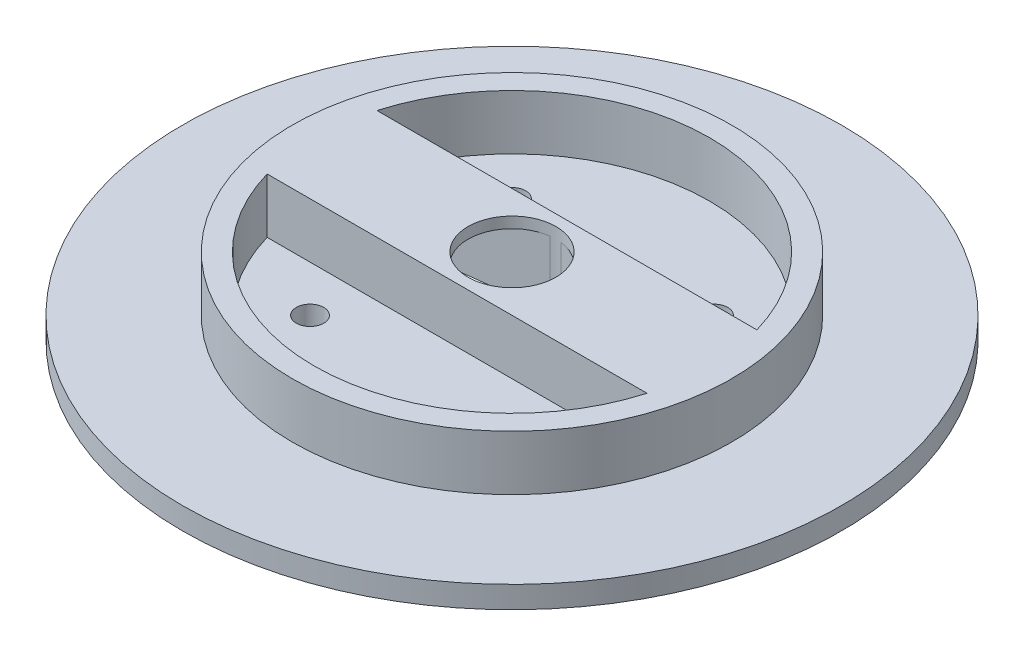
ISO-10303-21;
HEADER;
FILE_DESCRIPTION(('STEP AP214'),'2;1');
FILE_NAME('part.step','',(''),(''),'','','');
FILE_SCHEMA(('AUTOMOTIVE_DESIGN { 1 0 10303 214 1 1 1 1 }'));
ENDSEC;
DATA;
#1=APPLICATION_CONTEXT('core data for automotive mechanical design processes');
#2=APPLICATION_PROTOCOL_DEFINITION('international standard','automotive_design',2000,#1);
#3=PRODUCT_CONTEXT('',#1,'mechanical');
#4=PRODUCT('Part','Part','',(#3));
#5=PRODUCT_RELATED_PRODUCT_CATEGORY('part','',(#4));
#6=PRODUCT_DEFINITION_FORMATION('','',#4);
#7=PRODUCT_DEFINITION_CONTEXT('part definition',#1,'design');
#8=PRODUCT_DEFINITION('design','',#6,#7);
#9=PRODUCT_DEFINITION_SHAPE('','',#8);
#10=(LENGTH_UNIT() NAMED_UNIT(*) SI_UNIT(.MILLI.,.METRE.));
#11=(NAMED_UNIT(*) PLANE_ANGLE_UNIT() SI_UNIT($,.RADIAN.));
#12=(NAMED_UNIT(*) SI_UNIT($,.STERADIAN.) SOLID_ANGLE_UNIT());
#13=UNCERTAINTY_MEASURE_WITH_UNIT(LENGTH_MEASURE(1.E-05),#10,'distance_accuracy_value','');
#14=(GEOMETRIC_REPRESENTATION_CONTEXT(3) GLOBAL_UNCERTAINTY_ASSIGNED_CONTEXT((#13)) GLOBAL_UNIT_ASSIGNED_CONTEXT((#10,
#11,#12)) REPRESENTATION_CONTEXT('',''));
#15=CARTESIAN_POINT('',(0.,0.,0.));
#16=DIRECTION('',(0.,0.,1.));
#17=DIRECTION('',(1.,0.,0.));
#18=AXIS2_PLACEMENT_3D('',#15,#16,#17);
#19=CARTESIAN_POINT('',(0.,6.,0.));
#20=DIRECTION('',(0.,-1.,0.));
#21=DIRECTION('',(0.,0.,-1.));
#22=AXIS2_PLACEMENT_3D('',#19,#20,#21);
#23=PLANE('',#22);
#24=CARTESIAN_POINT('',(0.,6.,0.));
#25=DIRECTION('',(0.,-1.,0.));
#26=DIRECTION('',(0.,0.,-1.));
#27=AXIS2_PLACEMENT_3D('',#24,#25,#26);
#28=CIRCLE('',#27,4.);
#29=CARTESIAN_POINT('',(0.5,6.,-3.96862696659689));
#30=VERTEX_POINT('',#29);
#31=CARTESIAN_POINT('',(0.499999999999999,6.,3.96862696659689));
#32=VERTEX_POINT('',#31);
#33=EDGE_CURVE('E127',#30,#32,#28,.T.);
#34=ORIENTED_EDGE('',*,*,#33,.F.);
#35=DIRECTION('',(0.992156741649221,0.,0.125));
#36=VECTOR('',#35,1.);
#37=CARTESIAN_POINT('',(0.5,6.,-3.96862696659688));
#38=LINE('',#37,#36);
#39=CARTESIAN_POINT('',(16.25,6.,-1.98431348329844));
#40=VERTEX_POINT('',#39);
#41=EDGE_CURVE('E130',#30,#40,#38,.T.);
#42=ORIENTED_EDGE('',*,*,#41,.T.);
#43=CARTESIAN_POINT('',(16.,6.,0.));
#44=DIRECTION('',(0.,-1.,0.));
#45=DIRECTION('',(0.,0.,-1.));
#46=AXIS2_PLACEMENT_3D('',#43,#44,#45);
#47=CIRCLE('',#46,2.);
#48=CARTESIAN_POINT('',(16.25,6.,1.98431348329845));
#49=VERTEX_POINT('',#48);
#50=EDGE_CURVE('E147',#40,#49,#47,.T.);
#51=ORIENTED_EDGE('',*,*,#50,.T.);
#52=DIRECTION('',(-0.992156741649221,0.,0.125));
#53=VECTOR('',#52,1.);
#54=CARTESIAN_POINT('',(0.499999999999999,6.,3.96862696659689));
#55=LINE('',#54,#53);
#56=EDGE_CURVE('E132',#49,#32,#55,.T.);
#57=ORIENTED_EDGE('',*,*,#56,.T.);
#58=EDGE_LOOP('',(#34,#42,#51,#57));
#59=FACE_BOUND('',#58,.T.);
#60=ADVANCED_FACE('F35',(#59),#23,.T.);
#61=CARTESIAN_POINT('',(0.,2.,0.));
#62=DIRECTION('',(0.,1.,0.));
#63=DIRECTION('',(0.,0.,1.));
#64=AXIS2_PLACEMENT_3D('',#61,#62,#63);
#65=PLANE('',#64);
#66=CARTESIAN_POINT('',(9.1923881554251,2.,-9.19238815542513));
#67=DIRECTION('',(0.,1.,0.));
#68=DIRECTION('',(0.,0.,1.));
#69=AXIS2_PLACEMENT_3D('',#66,#67,#68);
#70=CIRCLE('',#69,1.25);
#71=CARTESIAN_POINT('',(9.1923881554251,2.,-7.94238815542513));
#72=VERTEX_POINT('',#71);
#73=EDGE_CURVE('E247',#72,#72,#70,.T.);
#74=ORIENTED_EDGE('',*,*,#73,.F.);
#75=EDGE_LOOP('',(#74));
#76=FACE_BOUND('',#75,.T.);
#77=CARTESIAN_POINT('',(-9.19238815542514,2.,-9.19238815542454));
#78=DIRECTION('',(0.,1.,0.));
#79=DIRECTION('',(0.,0.,1.));
#80=AXIS2_PLACEMENT_3D('',#77,#78,#79);
#81=CIRCLE('',#80,1.25);
#82=CARTESIAN_POINT('',(-9.19238815542514,2.,-7.94238815542454));
#83=VERTEX_POINT('',#82);
#84=EDGE_CURVE('E229',#83,#83,#81,.T.);
#85=ORIENTED_EDGE('',*,*,#84,.F.);
#86=EDGE_LOOP('',(#85));
#87=FACE_BOUND('',#86,.T.);
#88=DIRECTION('',(1.,0.,0.));
#89=VECTOR('',#88,1.);
#90=CARTESIAN_POINT('',(-17.2916164657906,2.,-5.));
#91=LINE('',#90,#89);
#92=CARTESIAN_POINT('',(-17.2916164657906,2.,-5.));
#93=VERTEX_POINT('',#92);
#94=CARTESIAN_POINT('',(17.2916164657906,2.,-5.));
#95=VERTEX_POINT('',#94);
#96=EDGE_CURVE('E215',#93,#95,#91,.T.);
#97=ORIENTED_EDGE('',*,*,#96,.T.);
#98=CARTESIAN_POINT('',(0.,2.,0.));
#99=DIRECTION('',(0.,1.,0.));
#100=DIRECTION('',(0.,0.,1.));
#101=AXIS2_PLACEMENT_3D('',#98,#99,#100);
#102=CIRCLE('',#101,18.);
#103=EDGE_CURVE('E210',#95,#93,#102,.T.);
#104=ORIENTED_EDGE('',*,*,#103,.T.);
#105=EDGE_LOOP('',(#97,#104));
#106=FACE_BOUND('',#105,.T.);
#107=ADVANCED_FACE('F289',(#76,#87,#106),#65,.T.);
#108=CARTESIAN_POINT('',(9.19238815542569,2.,9.1923881554251));
#109=DIRECTION('',(0.,1.,0.));
#110=DIRECTION('',(0.,0.,1.));
#111=AXIS2_PLACEMENT_3D('',#108,#109,#110);
#112=CIRCLE('',#111,1.25);
#113=CARTESIAN_POINT('',(9.19238815542569,2.,10.4423881554251));
#114=VERTEX_POINT('',#113);
#115=EDGE_CURVE('E241',#114,#114,#112,.T.);
#116=ORIENTED_EDGE('',*,*,#115,.F.);
#117=EDGE_LOOP('',(#116));
#118=FACE_BOUND('',#117,.T.);
#119=CARTESIAN_POINT('',(-9.19238815542455,2.,9.19238815542569));
#120=DIRECTION('',(0.,1.,0.));
#121=DIRECTION('',(0.,0.,1.));
#122=AXIS2_PLACEMENT_3D('',#119,#120,#121);
#123=CIRCLE('',#122,1.25);
#124=CARTESIAN_POINT('',(-9.19238815542455,2.,10.4423881554257));
#125=VERTEX_POINT('',#124);
#126=EDGE_CURVE('E235',#125,#125,#123,.T.);
#127=ORIENTED_EDGE('',*,*,#126,.F.);
#128=EDGE_LOOP('',(#127));
#129=FACE_BOUND('',#128,.T.);
#130=DIRECTION('',(-1.,0.,0.));
#131=VECTOR('',#130,1.);
#132=CARTESIAN_POINT('',(-17.2916164657906,2.,5.));
#133=LINE('',#132,#131);
#134=CARTESIAN_POINT('',(17.2916164657906,2.,5.));
#135=VERTEX_POINT('',#134);
#136=CARTESIAN_POINT('',(-17.2916164657906,2.,5.));
#137=VERTEX_POINT('',#136);
#138=EDGE_CURVE('E199',#135,#137,#133,.T.);
#139=ORIENTED_EDGE('',*,*,#138,.T.);
#140=CARTESIAN_POINT('',(0.,2.,0.));
#141=DIRECTION('',(0.,1.,0.));
#142=DIRECTION('',(0.,0.,1.));
#143=AXIS2_PLACEMENT_3D('',#140,#141,#142);
#144=CIRCLE('',#143,18.);
#145=EDGE_CURVE('E183',#137,#135,#144,.T.);
#146=ORIENTED_EDGE('',*,*,#145,.T.);
#147=EDGE_LOOP('',(#139,#146));
#148=FACE_BOUND('',#147,.T.);
#149=ADVANCED_FACE('F295',(#118,#129,#148),#65,.T.);
#150=CARTESIAN_POINT('',(0.,2.,0.));
#151=DIRECTION('',(0.,1.,0.));
#152=DIRECTION('',(0.,0.,1.));
#153=AXIS2_PLACEMENT_3D('',#150,#151,#152);
#154=CIRCLE('',#153,20.);
#155=CARTESIAN_POINT('',(0.,2.,20.));
#156=VERTEX_POINT('',#155);
#157=EDGE_CURVE('E11',#156,#156,#154,.T.);
#158=ORIENTED_EDGE('',*,*,#157,.F.);
#159=EDGE_LOOP('',(#158));
#160=FACE_BOUND('',#159,.T.);
#161=CARTESIAN_POINT('',(0.,2.,0.));
#162=DIRECTION('',(0.,1.,0.));
#163=DIRECTION('',(0.,0.,1.));
#164=AXIS2_PLACEMENT_3D('',#161,#162,#163);
#165=CIRCLE('',#164,30.);
#166=CARTESIAN_POINT('',(0.,2.,30.));
#167=VERTEX_POINT('',#166);
#168=EDGE_CURVE('E44',#167,#167,#165,.T.);
#169=ORIENTED_EDGE('',*,*,#168,.T.);
#170=EDGE_LOOP('',(#169));
#171=FACE_BOUND('',#170,.T.);
#172=ADVANCED_FACE('F261',(#160,#171),#65,.T.);
#173=CARTESIAN_POINT('',(0.,0.,0.));
#174=DIRECTION('',(0.,1.,0.));
#175=DIRECTION('',(0.,0.,1.));
#176=AXIS2_PLACEMENT_3D('',#173,#174,#175);
#177=PLANE('',#176);
#178=DIRECTION('',(0.992156741649221,0.,0.125));
#179=VECTOR('',#178,1.);
#180=CARTESIAN_POINT('',(0.5,0.,-3.96862696659688));
#181=LINE('',#180,#179);
#182=CARTESIAN_POINT('',(0.5,0.,-3.96862696659688));
#183=VERTEX_POINT('',#182);
#184=CARTESIAN_POINT('',(16.25,0.,-1.98431348329844));
#185=VERTEX_POINT('',#184);
#186=EDGE_CURVE('E165',#183,#185,#181,.T.);
#187=ORIENTED_EDGE('',*,*,#186,.F.);
#188=CARTESIAN_POINT('',(0.,0.,0.));
#189=DIRECTION('',(0.,-1.,0.));
#190=DIRECTION('',(0.,0.,-1.));
#191=AXIS2_PLACEMENT_3D('',#188,#189,#190);
#192=CIRCLE('',#191,4.);
#193=CARTESIAN_POINT('',(-0.5,0.,-3.96862696659688));
#194=VERTEX_POINT('',#193);
#195=EDGE_CURVE('E52',#194,#183,#192,.T.);
#196=ORIENTED_EDGE('',*,*,#195,.F.);
#197=DIRECTION('',(0.992156741649221,0.,-0.125));
#198=VECTOR('',#197,1.);
#199=CARTESIAN_POINT('',(-0.5,0.,-3.96862696659688));
#200=LINE('',#199,#198);
#201=CARTESIAN_POINT('',(-16.25,0.,-1.98431348329844));
#202=VERTEX_POINT('',#201);
#203=EDGE_CURVE('E148',#202,#194,#200,.T.);
#204=ORIENTED_EDGE('',*,*,#203,.F.);
#205=CARTESIAN_POINT('',(-16.,0.,0.));
#206=DIRECTION('',(0.,-1.,0.));
#207=DIRECTION('',(0.,0.,1.));
#208=AXIS2_PLACEMENT_3D('',#205,#206,#207);
#209=CIRCLE('',#208,2.);
#210=CARTESIAN_POINT('',(-16.25,0.,1.98431348329844));
#211=VERTEX_POINT('',#210);
#212=EDGE_CURVE('E152',#211,#202,#209,.T.);
#213=ORIENTED_EDGE('',*,*,#212,.F.);
#214=DIRECTION('',(-0.992156741649221,0.,-0.125));
#215=VECTOR('',#214,1.);
#216=CARTESIAN_POINT('',(-0.500000000000001,0.,3.96862696659689));
#217=LINE('',#216,#215);
#218=CARTESIAN_POINT('',(-0.500000000000001,0.,3.96862696659689));
#219=VERTEX_POINT('',#218);
#220=EDGE_CURVE('E176',#219,#211,#217,.T.);
#221=ORIENTED_EDGE('',*,*,#220,.F.);
#222=CARTESIAN_POINT('',(0.,0.,0.));
#223=DIRECTION('',(0.,-1.,0.));
#224=DIRECTION('',(0.,0.,-1.));
#225=AXIS2_PLACEMENT_3D('',#222,#223,#224);
#226=CIRCLE('',#225,4.);
#227=CARTESIAN_POINT('',(0.499999999999999,0.,3.96862696659689));
#228=VERTEX_POINT('',#227);
#229=EDGE_CURVE('E173',#228,#219,#226,.T.);
#230=ORIENTED_EDGE('',*,*,#229,.F.);
#231=DIRECTION('',(-0.992156741649221,0.,0.125));
#232=VECTOR('',#231,1.);
#233=CARTESIAN_POINT('',(0.499999999999999,0.,3.96862696659689));
#234=LINE('',#233,#232);
#235=CARTESIAN_POINT('',(16.25,0.,1.98431348329845));
#236=VERTEX_POINT('',#235);
#237=EDGE_CURVE('E170',#236,#228,#234,.T.);
#238=ORIENTED_EDGE('',*,*,#237,.F.);
#239=CARTESIAN_POINT('',(16.,0.,0.));
#240=DIRECTION('',(0.,-1.,0.));
#241=DIRECTION('',(0.,0.,-1.));
#242=AXIS2_PLACEMENT_3D('',#239,#240,#241);
#243=CIRCLE('',#242,2.);
#244=EDGE_CURVE('E167',#185,#236,#243,.T.);
#245=ORIENTED_EDGE('',*,*,#244,.F.);
#246=EDGE_LOOP('',(#187,#196,#204,#213,#221,#230,#238,#245));
#247=FACE_BOUND('',#246,.T.);
#248=CARTESIAN_POINT('',(0.,0.,0.));
#249=DIRECTION('',(0.,1.,0.));
#250=DIRECTION('',(0.,0.,1.));
#251=AXIS2_PLACEMENT_3D('',#248,#249,#250);
#252=CIRCLE('',#251,30.);
#253=CARTESIAN_POINT('',(0.,0.,30.));
#254=VERTEX_POINT('',#253);
#255=EDGE_CURVE('E250',#254,#254,#252,.T.);
#256=ORIENTED_EDGE('',*,*,#255,.F.);
#257=EDGE_LOOP('',(#256));
#258=FACE_BOUND('',#257,.T.);
#259=CARTESIAN_POINT('',(9.1923881554251,0.,-9.19238815542513));
#260=DIRECTION('',(0.,1.,0.));
#261=DIRECTION('',(0.,0.,1.));
#262=AXIS2_PLACEMENT_3D('',#259,#260,#261);
#263=CIRCLE('',#262,1.25);
#264=CARTESIAN_POINT('',(9.1923881554251,0.,-7.94238815542513));
#265=VERTEX_POINT('',#264);
#266=EDGE_CURVE('E244',#265,#265,#263,.T.);
#267=ORIENTED_EDGE('',*,*,#266,.T.);
#268=EDGE_LOOP('',(#267));
#269=FACE_BOUND('',#268,.T.);
#270=CARTESIAN_POINT('',(9.19238815542569,0.,9.1923881554251));
#271=DIRECTION('',(0.,1.,0.));
#272=DIRECTION('',(0.,0.,1.));
#273=AXIS2_PLACEMENT_3D('',#270,#271,#272);
#274=CIRCLE('',#273,1.25);
#275=CARTESIAN_POINT('',(9.19238815542569,0.,10.4423881554251));
#276=VERTEX_POINT('',#275);
#277=EDGE_CURVE('E238',#276,#276,#274,.T.);
#278=ORIENTED_EDGE('',*,*,#277,.T.);
#279=EDGE_LOOP('',(#278));
#280=FACE_BOUND('',#279,.T.);
#281=CARTESIAN_POINT('',(-9.19238815542455,0.,9.19238815542569));
#282=DIRECTION('',(0.,1.,0.));
#283=DIRECTION('',(0.,0.,1.));
#284=AXIS2_PLACEMENT_3D('',#281,#282,#283);
#285=CIRCLE('',#284,1.25);
#286=CARTESIAN_POINT('',(-9.19238815542455,0.,10.4423881554257));
#287=VERTEX_POINT('',#286);
#288=EDGE_CURVE('E232',#287,#287,#285,.T.);
#289=ORIENTED_EDGE('',*,*,#288,.T.);
#290=EDGE_LOOP('',(#289));
#291=FACE_BOUND('',#290,.T.);
#292=CARTESIAN_POINT('',(-9.19238815542514,0.,-9.19238815542454));
#293=DIRECTION('',(0.,1.,0.));
#294=DIRECTION('',(0.,0.,1.));
#295=AXIS2_PLACEMENT_3D('',#292,#293,#294);
#296=CIRCLE('',#295,1.25);
#297=CARTESIAN_POINT('',(-9.19238815542514,0.,-7.94238815542454));
#298=VERTEX_POINT('',#297);
#299=EDGE_CURVE('E227',#298,#298,#296,.T.);
#300=ORIENTED_EDGE('',*,*,#299,.T.);
#301=EDGE_LOOP('',(#300));
#302=FACE_BOUND('',#301,.T.);
#303=ADVANCED_FACE('F258',(#247,#258,#269,#280,#291,#302),#177,.F.);
#304=CARTESIAN_POINT('',(0.,2.,0.));
#305=DIRECTION('',(0.,-1.,0.));
#306=DIRECTION('',(0.,0.,-1.));
#307=AXIS2_PLACEMENT_3D('',#304,#305,#306);
#308=CYLINDRICAL_SURFACE('',#307,30.);
#309=ORIENTED_EDGE('',*,*,#168,.F.);
#310=EDGE_LOOP('',(#309));
#311=FACE_BOUND('',#310,.T.);
#312=ORIENTED_EDGE('',*,*,#255,.T.);
#313=EDGE_LOOP('',(#312));
#314=FACE_BOUND('',#313,.T.);
#315=ADVANCED_FACE('F37',(#311,#314),#308,.T.);
#316=CARTESIAN_POINT('',(9.1923881554251,2.,-9.19238815542513));
#317=DIRECTION('',(0.,-1.,0.));
#318=DIRECTION('',(0.,0.,-1.));
#319=AXIS2_PLACEMENT_3D('',#316,#317,#318);
#320=CYLINDRICAL_SURFACE('',#319,1.25);
#321=ORIENTED_EDGE('',*,*,#73,.T.);
#322=EDGE_LOOP('',(#321));
#323=FACE_BOUND('',#322,.T.);
#324=ORIENTED_EDGE('',*,*,#266,.F.);
#325=EDGE_LOOP('',(#324));
#326=FACE_BOUND('',#325,.T.);
#327=ADVANCED_FACE('F365',(#323,#326),#320,.F.);
#328=CARTESIAN_POINT('',(9.19238815542569,2.,9.1923881554251));
#329=DIRECTION('',(0.,-1.,0.));
#330=DIRECTION('',(0.,0.,-1.));
#331=AXIS2_PLACEMENT_3D('',#328,#329,#330);
#332=CYLINDRICAL_SURFACE('',#331,1.25);
#333=ORIENTED_EDGE('',*,*,#115,.T.);
#334=EDGE_LOOP('',(#333));
#335=FACE_BOUND('',#334,.T.);
#336=ORIENTED_EDGE('',*,*,#277,.F.);
#337=EDGE_LOOP('',(#336));
#338=FACE_BOUND('',#337,.T.);
#339=ADVANCED_FACE('F284',(#335,#338),#332,.F.);
#340=CARTESIAN_POINT('',(-9.19238815542455,2.,9.19238815542569));
#341=DIRECTION('',(0.,-1.,0.));
#342=DIRECTION('',(0.,0.,-1.));
#343=AXIS2_PLACEMENT_3D('',#340,#341,#342);
#344=CYLINDRICAL_SURFACE('',#343,1.25);
#345=ORIENTED_EDGE('',*,*,#126,.T.);
#346=EDGE_LOOP('',(#345));
#347=FACE_BOUND('',#346,.T.);
#348=ORIENTED_EDGE('',*,*,#288,.F.);
#349=EDGE_LOOP('',(#348));
#350=FACE_BOUND('',#349,.T.);
#351=ADVANCED_FACE('F274',(#347,#350),#344,.F.);
#352=CARTESIAN_POINT('',(-9.19238815542514,2.,-9.19238815542454));
#353=DIRECTION('',(0.,-1.,0.));
#354=DIRECTION('',(0.,0.,-1.));
#355=AXIS2_PLACEMENT_3D('',#352,#353,#354);
#356=CYLINDRICAL_SURFACE('',#355,1.25);
#357=ORIENTED_EDGE('',*,*,#84,.T.);
#358=EDGE_LOOP('',(#357));
#359=FACE_BOUND('',#358,.T.);
#360=ORIENTED_EDGE('',*,*,#299,.F.);
#361=EDGE_LOOP('',(#360));
#362=FACE_BOUND('',#361,.T.);
#363=ADVANCED_FACE('F271',(#359,#362),#356,.F.);
#364=CARTESIAN_POINT('',(0.,7.,0.));
#365=DIRECTION('',(0.,1.,0.));
#366=DIRECTION('',(0.,0.,1.));
#367=AXIS2_PLACEMENT_3D('',#364,#365,#366);
#368=PLANE('',#367);
#369=CARTESIAN_POINT('',(0.,7.,0.));
#370=DIRECTION('',(0.,1.,0.));
#371=DIRECTION('',(0.,0.,1.));
#372=AXIS2_PLACEMENT_3D('',#369,#370,#371);
#373=CIRCLE('',#372,4.);
#374=CARTESIAN_POINT('',(0.,7.,4.));
#375=VERTEX_POINT('',#374);
#376=EDGE_CURVE('E39',#375,#375,#373,.T.);
#377=ORIENTED_EDGE('',*,*,#376,.F.);
#378=EDGE_LOOP('',(#377));
#379=FACE_BOUND('',#378,.T.);
#380=CARTESIAN_POINT('',(0.,7.,0.));
#381=DIRECTION('',(0.,1.,0.));
#382=DIRECTION('',(0.,0.,1.));
#383=AXIS2_PLACEMENT_3D('',#380,#381,#382);
#384=CIRCLE('',#383,20.);
#385=CARTESIAN_POINT('',(0.,7.,20.));
#386=VERTEX_POINT('',#385);
#387=EDGE_CURVE('E225',#386,#386,#384,.T.);
#388=ORIENTED_EDGE('',*,*,#387,.T.);
#389=EDGE_LOOP('',(#388));
#390=FACE_BOUND('',#389,.T.);
#391=DIRECTION('',(1.,0.,0.));
#392=VECTOR('',#391,1.);
#393=CARTESIAN_POINT('',(-17.2916164657906,7.,-5.));
#394=LINE('',#393,#392);
#395=CARTESIAN_POINT('',(-17.2916164657906,7.,-5.));
#396=VERTEX_POINT('',#395);
#397=CARTESIAN_POINT('',(17.2916164657906,7.,-5.));
#398=VERTEX_POINT('',#397);
#399=EDGE_CURVE('E214',#396,#398,#394,.T.);
#400=ORIENTED_EDGE('',*,*,#399,.F.);
#401=CARTESIAN_POINT('',(0.,7.,0.));
#402=DIRECTION('',(0.,1.,0.));
#403=DIRECTION('',(0.,0.,1.));
#404=AXIS2_PLACEMENT_3D('',#401,#402,#403);
#405=CIRCLE('',#404,18.);
#406=EDGE_CURVE('E211',#398,#396,#405,.T.);
#407=ORIENTED_EDGE('',*,*,#406,.F.);
#408=EDGE_LOOP('',(#400,#407));
#409=FACE_BOUND('',#408,.T.);
#410=DIRECTION('',(-1.,0.,0.));
#411=VECTOR('',#410,1.);
#412=CARTESIAN_POINT('',(-17.2916164657906,7.,5.));
#413=LINE('',#412,#411);
#414=CARTESIAN_POINT('',(17.2916164657906,7.,5.));
#415=VERTEX_POINT('',#414);
#416=CARTESIAN_POINT('',(-17.2916164657906,7.,5.));
#417=VERTEX_POINT('',#416);
#418=EDGE_CURVE('E198',#415,#417,#413,.T.);
#419=ORIENTED_EDGE('',*,*,#418,.F.);
#420=CARTESIAN_POINT('',(0.,7.,0.));
#421=DIRECTION('',(0.,1.,0.));
#422=DIRECTION('',(0.,0.,1.));
#423=AXIS2_PLACEMENT_3D('',#420,#421,#422);
#424=CIRCLE('',#423,18.);
#425=EDGE_CURVE('E195',#417,#415,#424,.T.);
#426=ORIENTED_EDGE('',*,*,#425,.F.);
#427=EDGE_LOOP('',(#419,#426));
#428=FACE_BOUND('',#427,.T.);
#429=ADVANCED_FACE('F273',(#379,#390,#409,#428),#368,.T.);
#430=CARTESIAN_POINT('',(0.,7.,0.));
#431=DIRECTION('',(0.,-1.,0.));
#432=DIRECTION('',(0.,0.,-1.));
#433=AXIS2_PLACEMENT_3D('',#430,#431,#432);
#434=CYLINDRICAL_SURFACE('',#433,20.);
#435=ORIENTED_EDGE('',*,*,#387,.F.);
#436=EDGE_LOOP('',(#435));
#437=FACE_BOUND('',#436,.T.);
#438=ORIENTED_EDGE('',*,*,#157,.T.);
#439=EDGE_LOOP('',(#438));
#440=FACE_BOUND('',#439,.T.);
#441=ADVANCED_FACE('F281',(#437,#440),#434,.T.);
#442=CARTESIAN_POINT('',(0.,7.,0.));
#443=DIRECTION('',(0.,-1.,0.));
#444=DIRECTION('',(0.,0.,-1.));
#445=AXIS2_PLACEMENT_3D('',#442,#443,#444);
#446=CYLINDRICAL_SURFACE('',#445,18.);
#447=ORIENTED_EDGE('',*,*,#103,.F.);
#448=DIRECTION('',(0.,-1.,0.));
#449=VECTOR('',#448,1.);
#450=CARTESIAN_POINT('',(17.2916164657906,7.,-5.));
#451=LINE('',#450,#449);
#452=EDGE_CURVE('E60',#398,#95,#451,.T.);
#453=ORIENTED_EDGE('',*,*,#452,.F.);
#454=ORIENTED_EDGE('',*,*,#406,.T.);
#455=DIRECTION('',(0.,-1.,0.));
#456=VECTOR('',#455,1.);
#457=CARTESIAN_POINT('',(-17.2916164657906,7.,-5.));
#458=LINE('',#457,#456);
#459=EDGE_CURVE('E222',#396,#93,#458,.T.);
#460=ORIENTED_EDGE('',*,*,#459,.T.);
#461=EDGE_LOOP('',(#447,#453,#454,#460));
#462=FACE_BOUND('',#461,.T.);
#463=ADVANCED_FACE('F349',(#462),#446,.F.);
#464=CARTESIAN_POINT('',(-17.2916164657906,7.,-5.));
#465=DIRECTION('',(0.,0.,-1.));
#466=DIRECTION('',(-1.,0.,0.));
#467=AXIS2_PLACEMENT_3D('',#464,#465,#466);
#468=PLANE('',#467);
#469=ORIENTED_EDGE('',*,*,#96,.F.);
#470=ORIENTED_EDGE('',*,*,#459,.F.);
#471=ORIENTED_EDGE('',*,*,#399,.T.);
#472=ORIENTED_EDGE('',*,*,#452,.T.);
#473=EDGE_LOOP('',(#469,#470,#471,#472));
#474=FACE_BOUND('',#473,.T.);
#475=ADVANCED_FACE('F345',(#474),#468,.T.);
#476=CARTESIAN_POINT('',(0.,7.,0.));
#477=DIRECTION('',(0.,-1.,0.));
#478=DIRECTION('',(0.,0.,-1.));
#479=AXIS2_PLACEMENT_3D('',#476,#477,#478);
#480=CYLINDRICAL_SURFACE('',#479,18.);
#481=ORIENTED_EDGE('',*,*,#145,.F.);
#482=DIRECTION('',(0.,-1.,0.));
#483=VECTOR('',#482,1.);
#484=CARTESIAN_POINT('',(-17.2916164657906,7.,5.));
#485=LINE('',#484,#483);
#486=EDGE_CURVE('E201',#417,#137,#485,.T.);
#487=ORIENTED_EDGE('',*,*,#486,.F.);
#488=ORIENTED_EDGE('',*,*,#425,.T.);
#489=DIRECTION('',(0.,-1.,0.));
#490=VECTOR('',#489,1.);
#491=CARTESIAN_POINT('',(17.2916164657906,7.,5.));
#492=LINE('',#491,#490);
#493=EDGE_CURVE('E207',#415,#135,#492,.T.);
#494=ORIENTED_EDGE('',*,*,#493,.T.);
#495=EDGE_LOOP('',(#481,#487,#488,#494));
#496=FACE_BOUND('',#495,.T.);
#497=ADVANCED_FACE('F341',(#496),#480,.F.);
#498=CARTESIAN_POINT('',(-17.2916164657906,7.,5.));
#499=DIRECTION('',(0.,0.,1.));
#500=DIRECTION('',(1.,0.,0.));
#501=AXIS2_PLACEMENT_3D('',#498,#499,#500);
#502=PLANE('',#501);
#503=ORIENTED_EDGE('',*,*,#138,.F.);
#504=ORIENTED_EDGE('',*,*,#493,.F.);
#505=ORIENTED_EDGE('',*,*,#418,.T.);
#506=ORIENTED_EDGE('',*,*,#486,.T.);
#507=EDGE_LOOP('',(#503,#504,#505,#506));
#508=FACE_BOUND('',#507,.T.);
#509=ADVANCED_FACE('F338',(#508),#502,.T.);
#510=CARTESIAN_POINT('',(0.,6.,0.));
#511=DIRECTION('',(0.,-1.,0.));
#512=DIRECTION('',(0.,0.,-1.));
#513=AXIS2_PLACEMENT_3D('',#510,#511,#512);
#514=CYLINDRICAL_SURFACE('',#513,4.);
#515=ORIENTED_EDGE('',*,*,#195,.T.);
#516=DIRECTION('',(0.,-1.,0.));
#517=VECTOR('',#516,1.);
#518=CARTESIAN_POINT('',(0.5,6.,-3.96862696659688));
#519=LINE('',#518,#517);
#520=EDGE_CURVE('E136',#30,#183,#519,.T.);
#521=ORIENTED_EDGE('',*,*,#520,.F.);
#522=ORIENTED_EDGE('',*,*,#33,.T.);
#523=DIRECTION('',(0.,-1.,0.));
#524=VECTOR('',#523,1.);
#525=CARTESIAN_POINT('',(0.499999999999999,6.,3.96862696659689));
#526=LINE('',#525,#524);
#527=EDGE_CURVE('E190',#32,#228,#526,.T.);
#528=ORIENTED_EDGE('',*,*,#527,.T.);
#529=ORIENTED_EDGE('',*,*,#229,.T.);
#530=DIRECTION('',(0.,-1.,0.));
#531=VECTOR('',#530,1.);
#532=CARTESIAN_POINT('',(-0.500000000000001,6.,3.96862696659689));
#533=LINE('',#532,#531);
#534=CARTESIAN_POINT('',(-0.500000000000001,6.,3.96862696659689));
#535=VERTEX_POINT('',#534);
#536=EDGE_CURVE('E188',#535,#219,#533,.T.);
#537=ORIENTED_EDGE('',*,*,#536,.F.);
#538=CARTESIAN_POINT('',(-0.5,6.,-3.96862696659688));
#539=VERTEX_POINT('',#538);
#540=EDGE_CURVE('E134',#535,#539,#28,.T.);
#541=ORIENTED_EDGE('',*,*,#540,.T.);
#542=DIRECTION('',(0.,-1.,0.));
#543=VECTOR('',#542,1.);
#544=CARTESIAN_POINT('',(-0.5,6.,-3.96862696659688));
#545=LINE('',#544,#543);
#546=EDGE_CURVE('E181',#539,#194,#545,.T.);
#547=ORIENTED_EDGE('',*,*,#546,.T.);
#548=EDGE_LOOP('',(#515,#521,#522,#528,#529,#537,#541,#547));
#549=FACE_BOUND('',#548,.T.);
#550=ORIENTED_EDGE('',*,*,#376,.T.);
#551=EDGE_LOOP('',(#550));
#552=FACE_BOUND('',#551,.T.);
#553=ADVANCED_FACE('F137',(#549,#552),#514,.F.);
#554=CARTESIAN_POINT('',(-0.5,6.,-3.96862696659688));
#555=DIRECTION('',(-0.125,0.,-0.992156741649221));
#556=DIRECTION('',(-0.992156741649222,0.,0.125));
#557=AXIS2_PLACEMENT_3D('',#554,#555,#556);
#558=PLANE('',#557);
#559=ORIENTED_EDGE('',*,*,#203,.T.);
#560=ORIENTED_EDGE('',*,*,#546,.F.);
#561=DIRECTION('',(0.992156741649221,0.,-0.125));
#562=VECTOR('',#561,1.);
#563=CARTESIAN_POINT('',(-0.5,6.,-3.96862696659688));
#564=LINE('',#563,#562);
#565=CARTESIAN_POINT('',(-16.25,6.,-1.98431348329844));
#566=VERTEX_POINT('',#565);
#567=EDGE_CURVE('E143',#566,#539,#564,.T.);
#568=ORIENTED_EDGE('',*,*,#567,.F.);
#569=DIRECTION('',(0.,-1.,0.));
#570=VECTOR('',#569,1.);
#571=CARTESIAN_POINT('',(-16.25,6.,-1.98431348329844));
#572=LINE('',#571,#570);
#573=EDGE_CURVE('E184',#566,#202,#572,.T.);
#574=ORIENTED_EDGE('',*,*,#573,.T.);
#575=EDGE_LOOP('',(#559,#560,#568,#574));
#576=FACE_BOUND('',#575,.T.);
#577=ADVANCED_FACE('F319',(#576),#558,.F.);
#578=CARTESIAN_POINT('',(-16.,6.,0.));
#579=DIRECTION('',(0.,-1.,0.));
#580=DIRECTION('',(0.,0.,-1.));
#581=AXIS2_PLACEMENT_3D('',#578,#579,#580);
#582=CYLINDRICAL_SURFACE('',#581,2.);
#583=ORIENTED_EDGE('',*,*,#212,.T.);
#584=ORIENTED_EDGE('',*,*,#573,.F.);
#585=CARTESIAN_POINT('',(-16.,6.,0.));
#586=DIRECTION('',(0.,-1.,0.));
#587=DIRECTION('',(0.,0.,1.));
#588=AXIS2_PLACEMENT_3D('',#585,#586,#587);
#589=CIRCLE('',#588,2.);
#590=CARTESIAN_POINT('',(-16.25,6.,1.98431348329844));
#591=VERTEX_POINT('',#590);
#592=EDGE_CURVE('E159',#591,#566,#589,.T.);
#593=ORIENTED_EDGE('',*,*,#592,.F.);
#594=DIRECTION('',(0.,-1.,0.));
#595=VECTOR('',#594,1.);
#596=CARTESIAN_POINT('',(-16.25,6.,1.98431348329844));
#597=LINE('',#596,#595);
#598=EDGE_CURVE('E186',#591,#211,#597,.T.);
#599=ORIENTED_EDGE('',*,*,#598,.T.);
#600=EDGE_LOOP('',(#583,#584,#593,#599));
#601=FACE_BOUND('',#600,.T.);
#602=ADVANCED_FACE('F317',(#601),#582,.F.);
#603=CARTESIAN_POINT('',(-0.500000000000001,6.,3.96862696659689));
#604=DIRECTION('',(-0.125,0.,0.992156741649221));
#605=DIRECTION('',(0.992156741649221,0.,0.125));
#606=AXIS2_PLACEMENT_3D('',#603,#604,#605);
#607=PLANE('',#606);
#608=ORIENTED_EDGE('',*,*,#220,.T.);
#609=ORIENTED_EDGE('',*,*,#598,.F.);
#610=DIRECTION('',(-0.992156741649221,0.,-0.125));
#611=VECTOR('',#610,1.);
#612=CARTESIAN_POINT('',(-0.500000000000001,6.,3.96862696659689));
#613=LINE('',#612,#611);
#614=EDGE_CURVE('E156',#535,#591,#613,.T.);
#615=ORIENTED_EDGE('',*,*,#614,.F.);
#616=ORIENTED_EDGE('',*,*,#536,.T.);
#617=EDGE_LOOP('',(#608,#609,#615,#616));
#618=FACE_BOUND('',#617,.T.);
#619=ADVANCED_FACE('F313',(#618),#607,.F.);
#620=CARTESIAN_POINT('',(0.499999999999999,6.,3.96862696659689));
#621=DIRECTION('',(0.125,0.,0.992156741649221));
#622=DIRECTION('',(0.992156741649222,0.,-0.125));
#623=AXIS2_PLACEMENT_3D('',#620,#621,#622);
#624=PLANE('',#623);
#625=ORIENTED_EDGE('',*,*,#237,.T.);
#626=ORIENTED_EDGE('',*,*,#527,.F.);
#627=ORIENTED_EDGE('',*,*,#56,.F.);
#628=DIRECTION('',(0.,-1.,0.));
#629=VECTOR('',#628,1.);
#630=CARTESIAN_POINT('',(16.25,6.,1.98431348329845));
#631=LINE('',#630,#629);
#632=EDGE_CURVE('E192',#49,#236,#631,.T.);
#633=ORIENTED_EDGE('',*,*,#632,.T.);
#634=EDGE_LOOP('',(#625,#626,#627,#633));
#635=FACE_BOUND('',#634,.T.);
#636=ADVANCED_FACE('F325',(#635),#624,.F.);
#637=CARTESIAN_POINT('',(16.,6.,0.));
#638=DIRECTION('',(0.,-1.,0.));
#639=DIRECTION('',(0.,0.,-1.));
#640=AXIS2_PLACEMENT_3D('',#637,#638,#639);
#641=CYLINDRICAL_SURFACE('',#640,2.);
#642=ORIENTED_EDGE('',*,*,#244,.T.);
#643=ORIENTED_EDGE('',*,*,#632,.F.);
#644=ORIENTED_EDGE('',*,*,#50,.F.);
#645=DIRECTION('',(0.,-1.,0.));
#646=VECTOR('',#645,1.);
#647=CARTESIAN_POINT('',(16.25,6.,-1.98431348329844));
#648=LINE('',#647,#646);
#649=EDGE_CURVE('E142',#40,#185,#648,.T.);
#650=ORIENTED_EDGE('',*,*,#649,.T.);
#651=EDGE_LOOP('',(#642,#643,#644,#650));
#652=FACE_BOUND('',#651,.T.);
#653=ADVANCED_FACE('F304',(#652),#641,.F.);
#654=CARTESIAN_POINT('',(0.5,6.,-3.96862696659688));
#655=DIRECTION('',(0.125,0.,-0.992156741649221));
#656=DIRECTION('',(-0.992156741649222,0.,-0.125));
#657=AXIS2_PLACEMENT_3D('',#654,#655,#656);
#658=PLANE('',#657);
#659=ORIENTED_EDGE('',*,*,#186,.T.);
#660=ORIENTED_EDGE('',*,*,#649,.F.);
#661=ORIENTED_EDGE('',*,*,#41,.F.);
#662=ORIENTED_EDGE('',*,*,#520,.T.);
#663=EDGE_LOOP('',(#659,#660,#661,#662));
#664=FACE_BOUND('',#663,.T.);
#665=ADVANCED_FACE('F145',(#664),#658,.F.);
#666=ORIENTED_EDGE('',*,*,#540,.F.);
#667=ORIENTED_EDGE('',*,*,#614,.T.);
#668=ORIENTED_EDGE('',*,*,#592,.T.);
#669=ORIENTED_EDGE('',*,*,#567,.T.);
#670=EDGE_LOOP('',(#666,#667,#668,#669));
#671=FACE_BOUND('',#670,.T.);
#672=ADVANCED_FACE('F291',(#671),#23,.T.);
#673=CLOSED_SHELL('',(#60,#107,#149,#172,#303,#315,#327,#339,#351,#363,#429,#441,#463,#475,#497,
#509,#553,#577,#602,#619,#636,#653,#665,#672));
#674=MANIFOLD_SOLID_BREP('B2',#673);
#675=ADVANCED_BREP_SHAPE_REPRESENTATION('',(#18,#674),#14);
#676=SHAPE_DEFINITION_REPRESENTATION(#9,#675);
ENDSEC;
END-ISO-10303-21;
